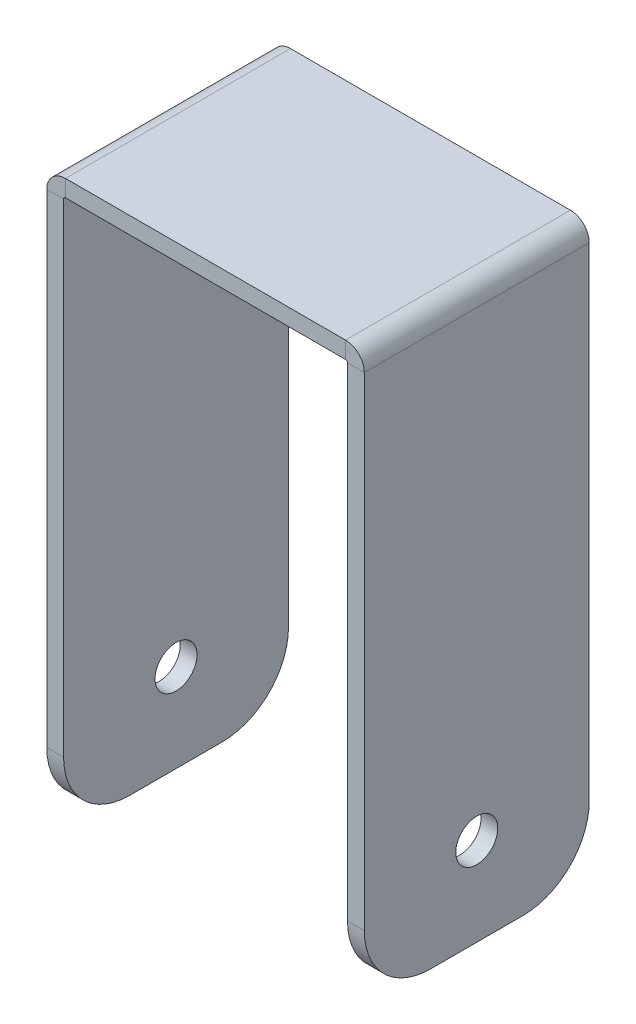
ISO-10303-21;
HEADER;
FILE_DESCRIPTION(('STEP AP214'),'2;1');
FILE_NAME('part.step','',(''),(''),'','','');
FILE_SCHEMA(('AUTOMOTIVE_DESIGN { 1 0 10303 214 1 1 1 1 }'));
ENDSEC;
DATA;
#1=APPLICATION_CONTEXT('core data for automotive mechanical design processes');
#2=APPLICATION_PROTOCOL_DEFINITION('international standard','automotive_design',2000,#1);
#3=PRODUCT_CONTEXT('',#1,'mechanical');
#4=PRODUCT('Part','Part','',(#3));
#5=PRODUCT_RELATED_PRODUCT_CATEGORY('part','',(#4));
#6=PRODUCT_DEFINITION_FORMATION('','',#4);
#7=PRODUCT_DEFINITION_CONTEXT('part definition',#1,'design');
#8=PRODUCT_DEFINITION('design','',#6,#7);
#9=PRODUCT_DEFINITION_SHAPE('','',#8);
#10=(LENGTH_UNIT() NAMED_UNIT(*) SI_UNIT(.MILLI.,.METRE.));
#11=(NAMED_UNIT(*) PLANE_ANGLE_UNIT() SI_UNIT($,.RADIAN.));
#12=(NAMED_UNIT(*) SI_UNIT($,.STERADIAN.) SOLID_ANGLE_UNIT());
#13=UNCERTAINTY_MEASURE_WITH_UNIT(LENGTH_MEASURE(1.E-05),#10,'distance_accuracy_value','');
#14=(GEOMETRIC_REPRESENTATION_CONTEXT(3) GLOBAL_UNCERTAINTY_ASSIGNED_CONTEXT((#13)) GLOBAL_UNIT_ASSIGNED_CONTEXT((#10,
#11,#12)) REPRESENTATION_CONTEXT('',''));
#15=CARTESIAN_POINT('',(0.,0.,0.));
#16=DIRECTION('',(0.,0.,1.));
#17=DIRECTION('',(1.,0.,0.));
#18=AXIS2_PLACEMENT_3D('',#15,#16,#17);
#19=CARTESIAN_POINT('',(-60.,-6.35,-42.5));
#20=DIRECTION('',(0.,0.,1.));
#21=DIRECTION('',(1.,0.,0.));
#22=AXIS2_PLACEMENT_3D('',#19,#20,#21);
#23=PLANE('',#22);
#24=DIRECTION('',(0.,1.,0.));
#25=VECTOR('',#24,1.);
#26=CARTESIAN_POINT('',(-52.9134,-6.34999999999998,-42.5));
#27=LINE('',#26,#25);
#28=CARTESIAN_POINT('',(-52.9134,-6.35,-42.5));
#29=VERTEX_POINT('',#28);
#30=CARTESIAN_POINT('',(-52.9134000000001,0.,-42.5));
#31=VERTEX_POINT('',#30);
#32=EDGE_CURVE('E284',#29,#31,#27,.T.);
#33=ORIENTED_EDGE('',*,*,#32,.T.);
#34=DIRECTION('',(1.,0.,0.));
#35=VECTOR('',#34,1.);
#36=CARTESIAN_POINT('',(-60.,0.,-42.5));
#37=LINE('',#36,#35);
#38=CARTESIAN_POINT('',(52.9134,0.,-42.5));
#39=VERTEX_POINT('',#38);
#40=EDGE_CURVE('E380',#31,#39,#37,.T.);
#41=ORIENTED_EDGE('',*,*,#40,.T.);
#42=DIRECTION('',(0.,1.,0.));
#43=VECTOR('',#42,1.);
#44=CARTESIAN_POINT('',(52.9134,-6.35000000000001,-42.5));
#45=LINE('',#44,#43);
#46=CARTESIAN_POINT('',(52.9134,-6.35,-42.5));
#47=VERTEX_POINT('',#46);
#48=EDGE_CURVE('E368',#47,#39,#45,.T.);
#49=ORIENTED_EDGE('',*,*,#48,.F.);
#50=DIRECTION('',(1.,0.,0.));
#51=VECTOR('',#50,1.);
#52=CARTESIAN_POINT('',(-60.,-6.35,-42.5));
#53=LINE('',#52,#51);
#54=EDGE_CURVE('E379',#29,#47,#53,.T.);
#55=ORIENTED_EDGE('',*,*,#54,.F.);
#56=EDGE_LOOP('',(#33,#41,#49,#55));
#57=FACE_BOUND('',#56,.T.);
#58=ADVANCED_FACE('F91',(#57),#23,.F.);
#59=CARTESIAN_POINT('',(0.,-6.35,0.));
#60=DIRECTION('',(0.,-1.,0.));
#61=DIRECTION('',(0.,0.,-1.));
#62=AXIS2_PLACEMENT_3D('',#59,#60,#61);
#63=PLANE('',#62);
#64=DIRECTION('',(1.,0.,0.));
#65=VECTOR('',#64,1.);
#66=CARTESIAN_POINT('',(-60.,-6.35,42.5));
#67=LINE('',#66,#65);
#68=CARTESIAN_POINT('',(-52.9134,-6.35,42.5));
#69=VERTEX_POINT('',#68);
#70=CARTESIAN_POINT('',(52.9134,-6.35,42.5));
#71=VERTEX_POINT('',#70);
#72=EDGE_CURVE('E376',#69,#71,#67,.T.);
#73=ORIENTED_EDGE('',*,*,#72,.F.);
#74=DIRECTION('',(0.,0.,-1.));
#75=VECTOR('',#74,1.);
#76=CARTESIAN_POINT('',(-52.9134,-6.34999999999998,-42.5));
#77=LINE('',#76,#75);
#78=EDGE_CURVE('E251',#29,#69,#77,.F.);
#79=ORIENTED_EDGE('',*,*,#78,.F.);
#80=ORIENTED_EDGE('',*,*,#54,.T.);
#81=DIRECTION('',(0.,0.,1.));
#82=VECTOR('',#81,1.);
#83=CARTESIAN_POINT('',(52.9134,-6.35000000000001,42.5));
#84=LINE('',#83,#82);
#85=EDGE_CURVE('E361',#71,#47,#84,.F.);
#86=ORIENTED_EDGE('',*,*,#85,.F.);
#87=EDGE_LOOP('',(#73,#79,#80,#86));
#88=FACE_BOUND('',#87,.T.);
#89=ADVANCED_FACE('F472',(#88),#63,.T.);
#90=CARTESIAN_POINT('',(0.,0.,0.));
#91=DIRECTION('',(0.,-1.,0.));
#92=DIRECTION('',(0.,0.,-1.));
#93=AXIS2_PLACEMENT_3D('',#90,#91,#92);
#94=PLANE('',#93);
#95=DIRECTION('',(0.,0.,-1.));
#96=VECTOR('',#95,1.);
#97=CARTESIAN_POINT('',(-52.9134000000001,0.,-42.5));
#98=LINE('',#97,#96);
#99=CARTESIAN_POINT('',(-52.9134,0.,42.5));
#100=VERTEX_POINT('',#99);
#101=EDGE_CURVE('E213',#31,#100,#98,.F.);
#102=ORIENTED_EDGE('',*,*,#101,.T.);
#103=DIRECTION('',(1.,0.,0.));
#104=VECTOR('',#103,1.);
#105=CARTESIAN_POINT('',(-60.,0.,42.5));
#106=LINE('',#105,#104);
#107=CARTESIAN_POINT('',(52.9134000000002,0.,42.5));
#108=VERTEX_POINT('',#107);
#109=EDGE_CURVE('E372',#100,#108,#106,.T.);
#110=ORIENTED_EDGE('',*,*,#109,.T.);
#111=DIRECTION('',(0.,0.,1.));
#112=VECTOR('',#111,1.);
#113=CARTESIAN_POINT('',(52.9134000000002,0.,42.5));
#114=LINE('',#113,#112);
#115=EDGE_CURVE('E344',#108,#39,#114,.F.);
#116=ORIENTED_EDGE('',*,*,#115,.T.);
#117=ORIENTED_EDGE('',*,*,#40,.F.);
#118=EDGE_LOOP('',(#102,#110,#116,#117));
#119=FACE_BOUND('',#118,.T.);
#120=ADVANCED_FACE('F477',(#119),#94,.F.);
#121=CARTESIAN_POINT('',(-60.,-6.35,42.5));
#122=DIRECTION('',(0.,0.,1.));
#123=DIRECTION('',(1.,0.,0.));
#124=AXIS2_PLACEMENT_3D('',#121,#122,#123);
#125=PLANE('',#124);
#126=DIRECTION('',(0.,1.,0.));
#127=VECTOR('',#126,1.);
#128=CARTESIAN_POINT('',(-52.9134,-6.34999999999998,42.5));
#129=LINE('',#128,#127);
#130=EDGE_CURVE('E292',#69,#100,#129,.T.);
#131=ORIENTED_EDGE('',*,*,#130,.F.);
#132=ORIENTED_EDGE('',*,*,#72,.T.);
#133=DIRECTION('',(0.,1.,0.));
#134=VECTOR('',#133,1.);
#135=CARTESIAN_POINT('',(52.9134,-6.35000000000001,42.5));
#136=LINE('',#135,#134);
#137=EDGE_CURVE('E353',#71,#108,#136,.T.);
#138=ORIENTED_EDGE('',*,*,#137,.T.);
#139=ORIENTED_EDGE('',*,*,#109,.F.);
#140=EDGE_LOOP('',(#131,#132,#138,#139));
#141=FACE_BOUND('',#140,.T.);
#142=ADVANCED_FACE('F475',(#141),#125,.T.);
#143=CARTESIAN_POINT('',(52.9134,-7.08659999999999,-42.5));
#144=DIRECTION('',(0.,0.,-1.));
#145=DIRECTION('',(-1.,0.,0.));
#146=AXIS2_PLACEMENT_3D('',#143,#144,#145);
#147=PLANE('',#146);
#148=DIRECTION('',(1.,0.,0.));
#149=VECTOR('',#148,1.);
#150=CARTESIAN_POINT('',(60.,-7.08659999999997,-42.5));
#151=LINE('',#150,#149);
#152=CARTESIAN_POINT('',(53.65,-7.08659999999999,-42.5));
#153=VERTEX_POINT('',#152);
#154=CARTESIAN_POINT('',(60.,-7.08659999999997,-42.4999999999999));
#155=VERTEX_POINT('',#154);
#156=EDGE_CURVE('E296',#153,#155,#151,.T.);
#157=ORIENTED_EDGE('',*,*,#156,.F.);
#158=CARTESIAN_POINT('',(52.9134,-7.08659999999999,-42.5));
#159=DIRECTION('',(0.,0.,1.));
#160=DIRECTION('',(1.,0.,0.));
#161=AXIS2_PLACEMENT_3D('',#158,#159,#160);
#162=CIRCLE('',#161,0.736599999999983);
#163=EDGE_CURVE('E357',#47,#153,#162,.F.);
#164=ORIENTED_EDGE('',*,*,#163,.F.);
#165=ORIENTED_EDGE('',*,*,#48,.T.);
#166=CARTESIAN_POINT('',(52.9134,-7.08659999999999,-42.4999999999999));
#167=DIRECTION('',(0.,0.,1.));
#168=DIRECTION('',(1.,0.,0.));
#169=AXIS2_PLACEMENT_3D('',#166,#167,#168);
#170=CIRCLE('',#169,7.08659999999998);
#171=EDGE_CURVE('E348',#39,#155,#170,.F.);
#172=ORIENTED_EDGE('',*,*,#171,.T.);
#173=EDGE_LOOP('',(#157,#164,#165,#172));
#174=FACE_BOUND('',#173,.T.);
#175=ADVANCED_FACE('F461',(#174),#147,.T.);
#176=CARTESIAN_POINT('',(52.9134,-7.08659999999999,42.5));
#177=DIRECTION('',(0.,0.,-1.));
#178=DIRECTION('',(-1.,0.,0.));
#179=AXIS2_PLACEMENT_3D('',#176,#177,#178);
#180=PLANE('',#179);
#181=CARTESIAN_POINT('',(52.9134,-7.08659999999999,42.5));
#182=DIRECTION('',(0.,0.,1.));
#183=DIRECTION('',(1.,0.,0.));
#184=AXIS2_PLACEMENT_3D('',#181,#182,#183);
#185=CIRCLE('',#184,0.736599999999983);
#186=CARTESIAN_POINT('',(53.65,-7.08659999999999,42.5));
#187=VERTEX_POINT('',#186);
#188=EDGE_CURVE('E302',#187,#71,#185,.T.);
#189=ORIENTED_EDGE('',*,*,#188,.F.);
#190=DIRECTION('',(1.,0.,0.));
#191=VECTOR('',#190,1.);
#192=CARTESIAN_POINT('',(53.65,-7.08659999999999,42.5));
#193=LINE('',#192,#191);
#194=CARTESIAN_POINT('',(60.,-7.08659999999997,42.5));
#195=VERTEX_POINT('',#194);
#196=EDGE_CURVE('E333',#187,#195,#193,.T.);
#197=ORIENTED_EDGE('',*,*,#196,.T.);
#198=CARTESIAN_POINT('',(52.9134,-7.08659999999999,42.5));
#199=DIRECTION('',(0.,0.,1.));
#200=DIRECTION('',(1.,0.,0.));
#201=AXIS2_PLACEMENT_3D('',#198,#199,#200);
#202=CIRCLE('',#201,7.08659999999998);
#203=EDGE_CURVE('E349',#195,#108,#202,.T.);
#204=ORIENTED_EDGE('',*,*,#203,.T.);
#205=ORIENTED_EDGE('',*,*,#137,.F.);
#206=EDGE_LOOP('',(#189,#197,#204,#205));
#207=FACE_BOUND('',#206,.T.);
#208=ADVANCED_FACE('F454',(#207),#180,.F.);
#209=CARTESIAN_POINT('',(52.9134,-7.08659999999999,42.5));
#210=DIRECTION('',(0.,0.,1.));
#211=DIRECTION('',(1.,0.,0.));
#212=AXIS2_PLACEMENT_3D('',#209,#210,#211);
#213=CYLINDRICAL_SURFACE('',#212,7.08659999999998);
#214=ORIENTED_EDGE('',*,*,#115,.F.);
#215=ORIENTED_EDGE('',*,*,#203,.F.);
#216=DIRECTION('',(0.,0.,1.));
#217=VECTOR('',#216,1.);
#218=CARTESIAN_POINT('',(60.,-7.08659999999997,0.));
#219=LINE('',#218,#217);
#220=EDGE_CURVE('E329',#155,#195,#219,.T.);
#221=ORIENTED_EDGE('',*,*,#220,.F.);
#222=ORIENTED_EDGE('',*,*,#171,.F.);
#223=EDGE_LOOP('',(#214,#215,#221,#222));
#224=FACE_BOUND('',#223,.T.);
#225=ADVANCED_FACE('F459',(#224),#213,.T.);
#226=CARTESIAN_POINT('',(52.9134,-7.08659999999999,42.5));
#227=DIRECTION('',(0.,0.,1.));
#228=DIRECTION('',(1.,0.,0.));
#229=AXIS2_PLACEMENT_3D('',#226,#227,#228);
#230=CYLINDRICAL_SURFACE('',#229,0.736599999999983);
#231=ORIENTED_EDGE('',*,*,#85,.T.);
#232=ORIENTED_EDGE('',*,*,#163,.T.);
#233=DIRECTION('',(0.,0.,-1.));
#234=VECTOR('',#233,1.);
#235=CARTESIAN_POINT('',(53.65,-7.08659999999999,-42.5));
#236=LINE('',#235,#234);
#237=EDGE_CURVE('E337',#153,#187,#236,.F.);
#238=ORIENTED_EDGE('',*,*,#237,.T.);
#239=ORIENTED_EDGE('',*,*,#188,.T.);
#240=EDGE_LOOP('',(#231,#232,#238,#239));
#241=FACE_BOUND('',#240,.T.);
#242=ADVANCED_FACE('F469',(#241),#230,.F.);
#243=CARTESIAN_POINT('',(60.,-6.34999999999998,42.5));
#244=DIRECTION('',(0.,0.,1.));
#245=DIRECTION('',(1.,0.,0.));
#246=AXIS2_PLACEMENT_3D('',#243,#244,#245);
#247=PLANE('',#246);
#248=DIRECTION('',(0.,-1.,0.));
#249=VECTOR('',#248,1.);
#250=CARTESIAN_POINT('',(53.65,2.0972728801015E-13,42.5));
#251=LINE('',#250,#249);
#252=CARTESIAN_POINT('',(53.6500000000007,-189.7875,42.5));
#253=VERTEX_POINT('',#252);
#254=EDGE_CURVE('E310',#253,#187,#251,.F.);
#255=ORIENTED_EDGE('',*,*,#254,.F.);
#256=DIRECTION('',(-1.,0.,0.));
#257=VECTOR('',#256,1.);
#258=CARTESIAN_POINT('',(60.0000000000007,-189.7875,42.5));
#259=LINE('',#258,#257);
#260=CARTESIAN_POINT('',(60.0000000000007,-189.7875,42.5));
#261=VERTEX_POINT('',#260);
#262=EDGE_CURVE('E13',#253,#261,#259,.F.);
#263=ORIENTED_EDGE('',*,*,#262,.T.);
#264=DIRECTION('',(0.,1.,0.));
#265=VECTOR('',#264,1.);
#266=CARTESIAN_POINT('',(60.,-6.34999999999998,42.5));
#267=LINE('',#266,#265);
#268=EDGE_CURVE('E299',#261,#195,#267,.T.);
#269=ORIENTED_EDGE('',*,*,#268,.T.);
#270=ORIENTED_EDGE('',*,*,#196,.F.);
#271=EDGE_LOOP('',(#255,#263,#269,#270));
#272=FACE_BOUND('',#271,.T.);
#273=ADVANCED_FACE('F450',(#272),#247,.T.);
#274=CARTESIAN_POINT('',(60.0000000000007,-214.7875,-42.5));
#275=DIRECTION('',(0.,0.,-1.));
#276=DIRECTION('',(-1.,0.,0.));
#277=AXIS2_PLACEMENT_3D('',#274,#275,#276);
#278=PLANE('',#277);
#279=DIRECTION('',(0.,-1.,0.));
#280=VECTOR('',#279,1.);
#281=CARTESIAN_POINT('',(60.0000000000007,-214.7875,-42.5));
#282=LINE('',#281,#280);
#283=CARTESIAN_POINT('',(60.0000000000006,-189.7875,-42.5));
#284=VERTEX_POINT('',#283);
#285=EDGE_CURVE('E306',#155,#284,#282,.T.);
#286=ORIENTED_EDGE('',*,*,#285,.T.);
#287=DIRECTION('',(-1.,0.,0.));
#288=VECTOR('',#287,1.);
#289=CARTESIAN_POINT('',(60.0000000000006,-189.7875,-42.5));
#290=LINE('',#289,#288);
#291=CARTESIAN_POINT('',(53.6500000000006,-189.7875,-42.5));
#292=VERTEX_POINT('',#291);
#293=EDGE_CURVE('E412',#284,#292,#290,.T.);
#294=ORIENTED_EDGE('',*,*,#293,.T.);
#295=DIRECTION('',(0.,1.,0.));
#296=VECTOR('',#295,1.);
#297=CARTESIAN_POINT('',(53.65,2.09727288010149E-13,-42.5));
#298=LINE('',#297,#296);
#299=EDGE_CURVE('E317',#153,#292,#298,.F.);
#300=ORIENTED_EDGE('',*,*,#299,.F.);
#301=ORIENTED_EDGE('',*,*,#156,.T.);
#302=EDGE_LOOP('',(#286,#294,#300,#301));
#303=FACE_BOUND('',#302,.T.);
#304=ADVANCED_FACE('F438',(#303),#278,.T.);
#305=CARTESIAN_POINT('',(60.,2.31898194511803E-13,0.));
#306=DIRECTION('',(1.,0.,0.));
#307=DIRECTION('',(0.,1.,0.));
#308=AXIS2_PLACEMENT_3D('',#305,#306,#307);
#309=PLANE('',#308);
#310=CARTESIAN_POINT('',(60.0000000000006,-181.45,0.));
#311=DIRECTION('',(1.,0.,0.));
#312=DIRECTION('',(0.,1.,0.));
#313=AXIS2_PLACEMENT_3D('',#310,#311,#312);
#314=CIRCLE('',#313,7.9375);
#315=CARTESIAN_POINT('',(60.0000000000006,-173.5125,0.));
#316=VERTEX_POINT('',#315);
#317=EDGE_CURVE('E321',#316,#316,#314,.F.);
#318=ORIENTED_EDGE('',*,*,#317,.T.);
#319=EDGE_LOOP('',(#318));
#320=FACE_BOUND('',#319,.T.);
#321=DIRECTION('',(0.,0.,1.));
#322=VECTOR('',#321,1.);
#323=CARTESIAN_POINT('',(60.0000000000008,-214.7875,42.5));
#324=LINE('',#323,#322);
#325=CARTESIAN_POINT('',(60.0000000000007,-214.7875,-17.5));
#326=VERTEX_POINT('',#325);
#327=CARTESIAN_POINT('',(60.0000000000007,-214.7875,17.5));
#328=VERTEX_POINT('',#327);
#329=EDGE_CURVE('E303',#326,#328,#324,.T.);
#330=ORIENTED_EDGE('',*,*,#329,.F.);
#331=CARTESIAN_POINT('',(60.0000000000006,-189.7875,-17.5));
#332=DIRECTION('',(1.,0.,0.));
#333=DIRECTION('',(0.,1.,0.));
#334=AXIS2_PLACEMENT_3D('',#331,#332,#333);
#335=CIRCLE('',#334,25.);
#336=EDGE_CURVE('E100',#326,#284,#335,.T.);
#337=ORIENTED_EDGE('',*,*,#336,.T.);
#338=ORIENTED_EDGE('',*,*,#285,.F.);
#339=ORIENTED_EDGE('',*,*,#220,.T.);
#340=ORIENTED_EDGE('',*,*,#268,.F.);
#341=CARTESIAN_POINT('',(60.0000000000007,-189.7875,17.5));
#342=DIRECTION('',(1.,0.,0.));
#343=DIRECTION('',(0.,1.,0.));
#344=AXIS2_PLACEMENT_3D('',#341,#342,#343);
#345=CIRCLE('',#344,25.);
#346=EDGE_CURVE('E112',#261,#328,#345,.T.);
#347=ORIENTED_EDGE('',*,*,#346,.T.);
#348=EDGE_LOOP('',(#330,#337,#338,#339,#340,#347));
#349=FACE_BOUND('',#348,.T.);
#350=ADVANCED_FACE('F433',(#320,#349),#309,.T.);
#351=CARTESIAN_POINT('',(53.65,2.09727288010149E-13,0.));
#352=DIRECTION('',(1.,0.,0.));
#353=DIRECTION('',(0.,1.,0.));
#354=AXIS2_PLACEMENT_3D('',#351,#352,#353);
#355=PLANE('',#354);
#356=CARTESIAN_POINT('',(53.6500000000006,-181.45,0.));
#357=DIRECTION('',(1.,0.,0.));
#358=DIRECTION('',(0.,1.,0.));
#359=AXIS2_PLACEMENT_3D('',#356,#357,#358);
#360=CIRCLE('',#359,7.9375);
#361=CARTESIAN_POINT('',(53.6500000000006,-173.5125,0.));
#362=VERTEX_POINT('',#361);
#363=EDGE_CURVE('E325',#362,#362,#360,.F.);
#364=ORIENTED_EDGE('',*,*,#363,.F.);
#365=EDGE_LOOP('',(#364));
#366=FACE_BOUND('',#365,.T.);
#367=ORIENTED_EDGE('',*,*,#299,.T.);
#368=CARTESIAN_POINT('',(53.6500000000007,-189.7875,-17.5));
#369=DIRECTION('',(1.,0.,0.));
#370=DIRECTION('',(0.,1.,0.));
#371=AXIS2_PLACEMENT_3D('',#368,#369,#370);
#372=CIRCLE('',#371,25.);
#373=CARTESIAN_POINT('',(53.6500000000007,-214.7875,-17.5));
#374=VERTEX_POINT('',#373);
#375=EDGE_CURVE('E419',#292,#374,#372,.F.);
#376=ORIENTED_EDGE('',*,*,#375,.T.);
#377=DIRECTION('',(0.,0.,-1.));
#378=VECTOR('',#377,1.);
#379=CARTESIAN_POINT('',(53.6500000000007,-214.7875,0.));
#380=LINE('',#379,#378);
#381=CARTESIAN_POINT('',(53.6500000000008,-214.7875,17.5));
#382=VERTEX_POINT('',#381);
#383=EDGE_CURVE('E313',#374,#382,#380,.F.);
#384=ORIENTED_EDGE('',*,*,#383,.T.);
#385=CARTESIAN_POINT('',(53.6500000000007,-189.7875,17.5));
#386=DIRECTION('',(1.,0.,0.));
#387=DIRECTION('',(0.,1.,0.));
#388=AXIS2_PLACEMENT_3D('',#385,#386,#387);
#389=CIRCLE('',#388,25.);
#390=EDGE_CURVE('E416',#382,#253,#389,.F.);
#391=ORIENTED_EDGE('',*,*,#390,.T.);
#392=ORIENTED_EDGE('',*,*,#254,.T.);
#393=ORIENTED_EDGE('',*,*,#237,.F.);
#394=EDGE_LOOP('',(#367,#376,#384,#391,#392,#393));
#395=FACE_BOUND('',#394,.T.);
#396=ADVANCED_FACE('F443',(#366,#395),#355,.F.);
#397=CARTESIAN_POINT('',(60.0000000000008,-214.7875,42.5));
#398=DIRECTION('',(0.,-1.,0.));
#399=DIRECTION('',(1.,0.,0.));
#400=AXIS2_PLACEMENT_3D('',#397,#398,#399);
#401=PLANE('',#400);
#402=ORIENTED_EDGE('',*,*,#383,.F.);
#403=DIRECTION('',(-1.,0.,0.));
#404=VECTOR('',#403,1.);
#405=CARTESIAN_POINT('',(60.0000000000007,-214.7875,-17.5));
#406=LINE('',#405,#404);
#407=EDGE_CURVE('E426',#374,#326,#406,.F.);
#408=ORIENTED_EDGE('',*,*,#407,.T.);
#409=ORIENTED_EDGE('',*,*,#329,.T.);
#410=DIRECTION('',(-1.,0.,0.));
#411=VECTOR('',#410,1.);
#412=CARTESIAN_POINT('',(60.0000000000007,-214.7875,17.5));
#413=LINE('',#412,#411);
#414=EDGE_CURVE('E422',#328,#382,#413,.T.);
#415=ORIENTED_EDGE('',*,*,#414,.T.);
#416=EDGE_LOOP('',(#402,#408,#409,#415));
#417=FACE_BOUND('',#416,.T.);
#418=ADVANCED_FACE('F446',(#417),#401,.T.);
#419=CARTESIAN_POINT('',(60.0000000000006,-181.45,0.));
#420=DIRECTION('',(-1.,0.,0.));
#421=DIRECTION('',(0.,-1.,0.));
#422=AXIS2_PLACEMENT_3D('',#419,#420,#421);
#423=CYLINDRICAL_SURFACE('',#422,7.9375);
#424=ORIENTED_EDGE('',*,*,#317,.F.);
#425=EDGE_LOOP('',(#424));
#426=FACE_BOUND('',#425,.T.);
#427=ORIENTED_EDGE('',*,*,#363,.T.);
#428=EDGE_LOOP('',(#427));
#429=FACE_BOUND('',#428,.T.);
#430=ADVANCED_FACE('F625',(#426,#429),#423,.F.);
#431=CARTESIAN_POINT('',(-52.9134,-7.08659999999999,42.5));
#432=DIRECTION('',(0.,0.,1.));
#433=DIRECTION('',(1.,0.,0.));
#434=AXIS2_PLACEMENT_3D('',#431,#432,#433);
#435=PLANE('',#434);
#436=DIRECTION('',(1.,0.,0.));
#437=VECTOR('',#436,1.);
#438=CARTESIAN_POINT('',(-60.,-7.08659999999997,42.5));
#439=LINE('',#438,#437);
#440=CARTESIAN_POINT('',(-53.65,-7.08659999999999,42.5));
#441=VERTEX_POINT('',#440);
#442=CARTESIAN_POINT('',(-60.,-7.08659999999997,42.5));
#443=VERTEX_POINT('',#442);
#444=EDGE_CURVE('E276',#441,#443,#439,.F.);
#445=ORIENTED_EDGE('',*,*,#444,.F.);
#446=CARTESIAN_POINT('',(-52.9134,-7.08659999999999,42.5));
#447=DIRECTION('',(0.,0.,-1.));
#448=DIRECTION('',(-1.,0.,0.));
#449=AXIS2_PLACEMENT_3D('',#446,#447,#448);
#450=CIRCLE('',#449,0.736600000000018);
#451=EDGE_CURVE('E217',#69,#441,#450,.F.);
#452=ORIENTED_EDGE('',*,*,#451,.F.);
#453=ORIENTED_EDGE('',*,*,#130,.T.);
#454=CARTESIAN_POINT('',(-52.9134,-7.08659999999999,42.5));
#455=DIRECTION('',(0.,0.,-1.));
#456=DIRECTION('',(-1.,0.,0.));
#457=AXIS2_PLACEMENT_3D('',#454,#455,#456);
#458=CIRCLE('',#457,7.08660000000002);
#459=EDGE_CURVE('E282',#100,#443,#458,.F.);
#460=ORIENTED_EDGE('',*,*,#459,.T.);
#461=EDGE_LOOP('',(#445,#452,#453,#460));
#462=FACE_BOUND('',#461,.T.);
#463=ADVANCED_FACE('F616',(#462),#435,.T.);
#464=CARTESIAN_POINT('',(-52.9134,-7.08659999999999,-42.5));
#465=DIRECTION('',(0.,0.,1.));
#466=DIRECTION('',(1.,0.,0.));
#467=AXIS2_PLACEMENT_3D('',#464,#465,#466);
#468=PLANE('',#467);
#469=CARTESIAN_POINT('',(-52.9134,-7.08659999999999,-42.5));
#470=DIRECTION('',(0.,0.,-1.));
#471=DIRECTION('',(-1.,0.,0.));
#472=AXIS2_PLACEMENT_3D('',#469,#470,#471);
#473=CIRCLE('',#472,0.736600000000018);
#474=CARTESIAN_POINT('',(-53.65,-7.08659999999999,-42.5));
#475=VERTEX_POINT('',#474);
#476=EDGE_CURVE('E224',#475,#29,#473,.T.);
#477=ORIENTED_EDGE('',*,*,#476,.F.);
#478=DIRECTION('',(1.,0.,0.));
#479=VECTOR('',#478,1.);
#480=CARTESIAN_POINT('',(-53.65,-7.08659999999999,-42.5));
#481=LINE('',#480,#479);
#482=CARTESIAN_POINT('',(-60.,-7.08659999999997,-42.5));
#483=VERTEX_POINT('',#482);
#484=EDGE_CURVE('E221',#475,#483,#481,.F.);
#485=ORIENTED_EDGE('',*,*,#484,.T.);
#486=CARTESIAN_POINT('',(-52.9134,-7.08659999999999,-42.5));
#487=DIRECTION('',(0.,0.,-1.));
#488=DIRECTION('',(-1.,0.,0.));
#489=AXIS2_PLACEMENT_3D('',#486,#487,#488);
#490=CIRCLE('',#489,7.08660000000002);
#491=EDGE_CURVE('E206',#483,#31,#490,.T.);
#492=ORIENTED_EDGE('',*,*,#491,.T.);
#493=ORIENTED_EDGE('',*,*,#32,.F.);
#494=EDGE_LOOP('',(#477,#485,#492,#493));
#495=FACE_BOUND('',#494,.T.);
#496=ADVANCED_FACE('F222',(#495),#468,.F.);
#497=CARTESIAN_POINT('',(-52.9134,-7.08659999999999,-42.5));
#498=DIRECTION('',(0.,0.,-1.));
#499=DIRECTION('',(-1.,0.,0.));
#500=AXIS2_PLACEMENT_3D('',#497,#498,#499);
#501=CYLINDRICAL_SURFACE('',#500,7.08660000000002);
#502=ORIENTED_EDGE('',*,*,#101,.F.);
#503=ORIENTED_EDGE('',*,*,#491,.F.);
#504=DIRECTION('',(0.,0.,-1.));
#505=VECTOR('',#504,1.);
#506=CARTESIAN_POINT('',(-60.,-7.08659999999997,0.));
#507=LINE('',#506,#505);
#508=EDGE_CURVE('E211',#443,#483,#507,.T.);
#509=ORIENTED_EDGE('',*,*,#508,.F.);
#510=ORIENTED_EDGE('',*,*,#459,.F.);
#511=EDGE_LOOP('',(#502,#503,#509,#510));
#512=FACE_BOUND('',#511,.T.);
#513=ADVANCED_FACE('F208',(#512),#501,.T.);
#514=CARTESIAN_POINT('',(-52.9134,-7.08659999999999,-42.5));
#515=DIRECTION('',(0.,0.,-1.));
#516=DIRECTION('',(-1.,0.,0.));
#517=AXIS2_PLACEMENT_3D('',#514,#515,#516);
#518=CYLINDRICAL_SURFACE('',#517,0.736600000000018);
#519=ORIENTED_EDGE('',*,*,#78,.T.);
#520=ORIENTED_EDGE('',*,*,#451,.T.);
#521=DIRECTION('',(0.,0.,1.));
#522=VECTOR('',#521,1.);
#523=CARTESIAN_POINT('',(-53.65,-7.08659999999999,42.5));
#524=LINE('',#523,#522);
#525=EDGE_CURVE('E230',#441,#475,#524,.F.);
#526=ORIENTED_EDGE('',*,*,#525,.T.);
#527=ORIENTED_EDGE('',*,*,#476,.T.);
#528=EDGE_LOOP('',(#519,#520,#526,#527));
#529=FACE_BOUND('',#528,.T.);
#530=ADVANCED_FACE('F586',(#529),#518,.F.);
#531=CARTESIAN_POINT('',(-60.,2.31898194511803E-13,0.));
#532=DIRECTION('',(-1.,0.,0.));
#533=DIRECTION('',(0.,1.,0.));
#534=AXIS2_PLACEMENT_3D('',#531,#532,#533);
#535=PLANE('',#534);
#536=CARTESIAN_POINT('',(-60.0000000000006,-181.45,0.));
#537=DIRECTION('',(-1.,0.,0.));
#538=DIRECTION('',(0.,-1.,0.));
#539=AXIS2_PLACEMENT_3D('',#536,#537,#538);
#540=CIRCLE('',#539,7.9375);
#541=CARTESIAN_POINT('',(-60.0000000000006,-189.3875,0.));
#542=VERTEX_POINT('',#541);
#543=EDGE_CURVE('E267',#542,#542,#540,.T.);
#544=ORIENTED_EDGE('',*,*,#543,.F.);
#545=EDGE_LOOP('',(#544));
#546=FACE_BOUND('',#545,.T.);
#547=DIRECTION('',(0.,0.,-1.));
#548=VECTOR('',#547,1.);
#549=CARTESIAN_POINT('',(-60.0000000000007,-214.7875,0.));
#550=LINE('',#549,#548);
#551=CARTESIAN_POINT('',(-60.0000000000007,-214.7875,-17.5));
#552=VERTEX_POINT('',#551);
#553=CARTESIAN_POINT('',(-60.0000000000007,-214.7875,17.5));
#554=VERTEX_POINT('',#553);
#555=EDGE_CURVE('E247',#552,#554,#550,.F.);
#556=ORIENTED_EDGE('',*,*,#555,.T.);
#557=CARTESIAN_POINT('',(-60.0000000000007,-189.7875,17.5));
#558=DIRECTION('',(-1.,0.,0.));
#559=DIRECTION('',(0.,-1.,0.));
#560=AXIS2_PLACEMENT_3D('',#557,#558,#559);
#561=CIRCLE('',#560,25.);
#562=CARTESIAN_POINT('',(-60.0000000000007,-189.7875,42.5));
#563=VERTEX_POINT('',#562);
#564=EDGE_CURVE('E407',#554,#563,#561,.T.);
#565=ORIENTED_EDGE('',*,*,#564,.T.);
#566=DIRECTION('',(0.,-1.,0.));
#567=VECTOR('',#566,1.);
#568=CARTESIAN_POINT('',(-60.,2.31898194511803E-13,42.5));
#569=LINE('',#568,#567);
#570=EDGE_CURVE('E239',#563,#443,#569,.F.);
#571=ORIENTED_EDGE('',*,*,#570,.T.);
#572=ORIENTED_EDGE('',*,*,#508,.T.);
#573=DIRECTION('',(0.,1.,0.));
#574=VECTOR('',#573,1.);
#575=CARTESIAN_POINT('',(-60.,2.31898194511803E-13,-42.5));
#576=LINE('',#575,#574);
#577=CARTESIAN_POINT('',(-60.0000000000006,-189.7875,-42.5));
#578=VERTEX_POINT('',#577);
#579=EDGE_CURVE('E236',#483,#578,#576,.F.);
#580=ORIENTED_EDGE('',*,*,#579,.T.);
#581=CARTESIAN_POINT('',(-60.0000000000006,-189.7875,-17.5));
#582=DIRECTION('',(-1.,0.,0.));
#583=DIRECTION('',(0.,-1.,0.));
#584=AXIS2_PLACEMENT_3D('',#581,#582,#583);
#585=CIRCLE('',#584,25.);
#586=EDGE_CURVE('E404',#578,#552,#585,.T.);
#587=ORIENTED_EDGE('',*,*,#586,.T.);
#588=EDGE_LOOP('',(#556,#565,#571,#572,#580,#587));
#589=FACE_BOUND('',#588,.T.);
#590=ADVANCED_FACE('F235',(#546,#589),#535,.T.);
#591=CARTESIAN_POINT('',(-53.65,2.09727288010149E-13,0.));
#592=DIRECTION('',(-1.,0.,0.));
#593=DIRECTION('',(0.,1.,0.));
#594=AXIS2_PLACEMENT_3D('',#591,#592,#593);
#595=PLANE('',#594);
#596=CARTESIAN_POINT('',(-53.6500000000006,-181.45,0.));
#597=DIRECTION('',(-1.,0.,0.));
#598=DIRECTION('',(0.,-1.,0.));
#599=AXIS2_PLACEMENT_3D('',#596,#597,#598);
#600=CIRCLE('',#599,7.9375);
#601=CARTESIAN_POINT('',(-53.6500000000007,-189.3875,0.));
#602=VERTEX_POINT('',#601);
#603=EDGE_CURVE('E241',#602,#602,#600,.T.);
#604=ORIENTED_EDGE('',*,*,#603,.T.);
#605=EDGE_LOOP('',(#604));
#606=FACE_BOUND('',#605,.T.);
#607=DIRECTION('',(0.,1.,0.));
#608=VECTOR('',#607,1.);
#609=CARTESIAN_POINT('',(-53.65,-6.35,42.5));
#610=LINE('',#609,#608);
#611=CARTESIAN_POINT('',(-53.6500000000007,-189.7875,42.5));
#612=VERTEX_POINT('',#611);
#613=EDGE_CURVE('E264',#612,#441,#610,.T.);
#614=ORIENTED_EDGE('',*,*,#613,.F.);
#615=CARTESIAN_POINT('',(-53.6500000000007,-189.7875,17.5));
#616=DIRECTION('',(-1.,0.,0.));
#617=DIRECTION('',(0.,-1.,0.));
#618=AXIS2_PLACEMENT_3D('',#615,#616,#617);
#619=CIRCLE('',#618,25.);
#620=CARTESIAN_POINT('',(-53.6500000000008,-214.7875,17.5));
#621=VERTEX_POINT('',#620);
#622=EDGE_CURVE('E394',#612,#621,#619,.F.);
#623=ORIENTED_EDGE('',*,*,#622,.T.);
#624=DIRECTION('',(0.,0.,1.));
#625=VECTOR('',#624,1.);
#626=CARTESIAN_POINT('',(-53.6500000000008,-214.7875,42.5));
#627=LINE('',#626,#625);
#628=CARTESIAN_POINT('',(-53.6500000000007,-214.7875,-17.5));
#629=VERTEX_POINT('',#628);
#630=EDGE_CURVE('E260',#629,#621,#627,.T.);
#631=ORIENTED_EDGE('',*,*,#630,.F.);
#632=CARTESIAN_POINT('',(-53.6500000000007,-189.7875,-17.5));
#633=DIRECTION('',(-1.,0.,0.));
#634=DIRECTION('',(0.,-1.,0.));
#635=AXIS2_PLACEMENT_3D('',#632,#633,#634);
#636=CIRCLE('',#635,25.);
#637=CARTESIAN_POINT('',(-53.6500000000006,-189.7875,-42.5));
#638=VERTEX_POINT('',#637);
#639=EDGE_CURVE('E391',#629,#638,#636,.F.);
#640=ORIENTED_EDGE('',*,*,#639,.T.);
#641=DIRECTION('',(0.,-1.,0.));
#642=VECTOR('',#641,1.);
#643=CARTESIAN_POINT('',(-53.6500000000007,-214.7875,-42.5));
#644=LINE('',#643,#642);
#645=EDGE_CURVE('E257',#475,#638,#644,.T.);
#646=ORIENTED_EDGE('',*,*,#645,.F.);
#647=ORIENTED_EDGE('',*,*,#525,.F.);
#648=EDGE_LOOP('',(#614,#623,#631,#640,#646,#647));
#649=FACE_BOUND('',#648,.T.);
#650=ADVANCED_FACE('F566',(#606,#649),#595,.F.);
#651=CARTESIAN_POINT('',(-60.0000000000007,-214.7875,-42.5));
#652=DIRECTION('',(0.,0.,1.));
#653=DIRECTION('',(1.,0.,0.));
#654=AXIS2_PLACEMENT_3D('',#651,#652,#653);
#655=PLANE('',#654);
#656=ORIENTED_EDGE('',*,*,#645,.T.);
#657=DIRECTION('',(1.,0.,0.));
#658=VECTOR('',#657,1.);
#659=CARTESIAN_POINT('',(-60.0000000000006,-189.7875,-42.5));
#660=LINE('',#659,#658);
#661=EDGE_CURVE('E245',#638,#578,#660,.F.);
#662=ORIENTED_EDGE('',*,*,#661,.T.);
#663=ORIENTED_EDGE('',*,*,#579,.F.);
#664=ORIENTED_EDGE('',*,*,#484,.F.);
#665=EDGE_LOOP('',(#656,#662,#663,#664));
#666=FACE_BOUND('',#665,.T.);
#667=ADVANCED_FACE('F243',(#666),#655,.F.);
#668=CARTESIAN_POINT('',(-60.,-6.34999999999998,42.5));
#669=DIRECTION('',(0.,0.,-1.));
#670=DIRECTION('',(-1.,0.,0.));
#671=AXIS2_PLACEMENT_3D('',#668,#669,#670);
#672=PLANE('',#671);
#673=ORIENTED_EDGE('',*,*,#570,.F.);
#674=DIRECTION('',(1.,0.,0.));
#675=VECTOR('',#674,1.);
#676=CARTESIAN_POINT('',(-60.0000000000007,-189.7875,42.5));
#677=LINE('',#676,#675);
#678=EDGE_CURVE('E383',#563,#612,#677,.T.);
#679=ORIENTED_EDGE('',*,*,#678,.T.);
#680=ORIENTED_EDGE('',*,*,#613,.T.);
#681=ORIENTED_EDGE('',*,*,#444,.T.);
#682=EDGE_LOOP('',(#673,#679,#680,#681));
#683=FACE_BOUND('',#682,.T.);
#684=ADVANCED_FACE('F545',(#683),#672,.F.);
#685=CARTESIAN_POINT('',(-60.0000000000008,-214.7875,42.5));
#686=DIRECTION('',(0.,1.,0.));
#687=DIRECTION('',(-1.,0.,0.));
#688=AXIS2_PLACEMENT_3D('',#685,#686,#687);
#689=PLANE('',#688);
#690=ORIENTED_EDGE('',*,*,#630,.T.);
#691=DIRECTION('',(1.,0.,0.));
#692=VECTOR('',#691,1.);
#693=CARTESIAN_POINT('',(-60.0000000000007,-214.7875,17.5));
#694=LINE('',#693,#692);
#695=EDGE_CURVE('E401',#621,#554,#694,.F.);
#696=ORIENTED_EDGE('',*,*,#695,.T.);
#697=ORIENTED_EDGE('',*,*,#555,.F.);
#698=DIRECTION('',(1.,0.,0.));
#699=VECTOR('',#698,1.);
#700=CARTESIAN_POINT('',(-60.0000000000007,-214.7875,-17.5));
#701=LINE('',#700,#699);
#702=EDGE_CURVE('E397',#552,#629,#701,.T.);
#703=ORIENTED_EDGE('',*,*,#702,.T.);
#704=EDGE_LOOP('',(#690,#696,#697,#703));
#705=FACE_BOUND('',#704,.T.);
#706=ADVANCED_FACE('F533',(#705),#689,.F.);
#707=CARTESIAN_POINT('',(-60.0000000000006,-181.45,0.));
#708=DIRECTION('',(1.,0.,0.));
#709=DIRECTION('',(0.,1.,0.));
#710=AXIS2_PLACEMENT_3D('',#707,#708,#709);
#711=CYLINDRICAL_SURFACE('',#710,7.9375);
#712=ORIENTED_EDGE('',*,*,#543,.T.);
#713=EDGE_LOOP('',(#712));
#714=FACE_BOUND('',#713,.T.);
#715=ORIENTED_EDGE('',*,*,#603,.F.);
#716=EDGE_LOOP('',(#715));
#717=FACE_BOUND('',#716,.T.);
#718=ADVANCED_FACE('F496',(#714,#717),#711,.F.);
#719=CARTESIAN_POINT('',(-60.0000000000007,-189.7875,17.5));
#720=DIRECTION('',(1.,0.,0.));
#721=DIRECTION('',(0.,1.,0.));
#722=AXIS2_PLACEMENT_3D('',#719,#720,#721);
#723=CYLINDRICAL_SURFACE('',#722,25.);
#724=ORIENTED_EDGE('',*,*,#564,.F.);
#725=ORIENTED_EDGE('',*,*,#695,.F.);
#726=ORIENTED_EDGE('',*,*,#622,.F.);
#727=ORIENTED_EDGE('',*,*,#678,.F.);
#728=EDGE_LOOP('',(#724,#725,#726,#727));
#729=FACE_BOUND('',#728,.T.);
#730=ADVANCED_FACE('F492',(#729),#723,.T.);
#731=CARTESIAN_POINT('',(-60.0000000000006,-189.7875,-17.5));
#732=DIRECTION('',(1.,0.,0.));
#733=DIRECTION('',(0.,1.,0.));
#734=AXIS2_PLACEMENT_3D('',#731,#732,#733);
#735=CYLINDRICAL_SURFACE('',#734,25.);
#736=ORIENTED_EDGE('',*,*,#586,.F.);
#737=ORIENTED_EDGE('',*,*,#661,.F.);
#738=ORIENTED_EDGE('',*,*,#639,.F.);
#739=ORIENTED_EDGE('',*,*,#702,.F.);
#740=EDGE_LOOP('',(#736,#737,#738,#739));
#741=FACE_BOUND('',#740,.T.);
#742=ADVANCED_FACE('F495',(#741),#735,.T.);
#743=CARTESIAN_POINT('',(60.0000000000006,-189.7875,-17.5));
#744=DIRECTION('',(-1.,0.,0.));
#745=DIRECTION('',(0.,-1.,0.));
#746=AXIS2_PLACEMENT_3D('',#743,#744,#745);
#747=CYLINDRICAL_SURFACE('',#746,25.);
#748=ORIENTED_EDGE('',*,*,#336,.F.);
#749=ORIENTED_EDGE('',*,*,#407,.F.);
#750=ORIENTED_EDGE('',*,*,#375,.F.);
#751=ORIENTED_EDGE('',*,*,#293,.F.);
#752=EDGE_LOOP('',(#748,#749,#750,#751));
#753=FACE_BOUND('',#752,.T.);
#754=ADVANCED_FACE('F440',(#753),#747,.T.);
#755=CARTESIAN_POINT('',(60.0000000000007,-189.7875,17.5));
#756=DIRECTION('',(-1.,0.,0.));
#757=DIRECTION('',(0.,-1.,0.));
#758=AXIS2_PLACEMENT_3D('',#755,#756,#757);
#759=CYLINDRICAL_SURFACE('',#758,25.);
#760=ORIENTED_EDGE('',*,*,#346,.F.);
#761=ORIENTED_EDGE('',*,*,#262,.F.);
#762=ORIENTED_EDGE('',*,*,#390,.F.);
#763=ORIENTED_EDGE('',*,*,#414,.F.);
#764=EDGE_LOOP('',(#760,#761,#762,#763));
#765=FACE_BOUND('',#764,.T.);
#766=ADVANCED_FACE('F93',(#765),#759,.T.);
#767=CLOSED_SHELL('',(#58,#89,#120,#142,#175,#208,#225,#242,#273,#304,#350,#396,#418,#430,#463,
#496,#513,#530,#590,#650,#667,#684,#706,#718,#730,#742,#754,#766));
#768=MANIFOLD_SOLID_BREP('B2',#767);
#769=ADVANCED_BREP_SHAPE_REPRESENTATION('',(#18,#768),#14);
#770=SHAPE_DEFINITION_REPRESENTATION(#9,#769);
ENDSEC;
END-ISO-10303-21;
